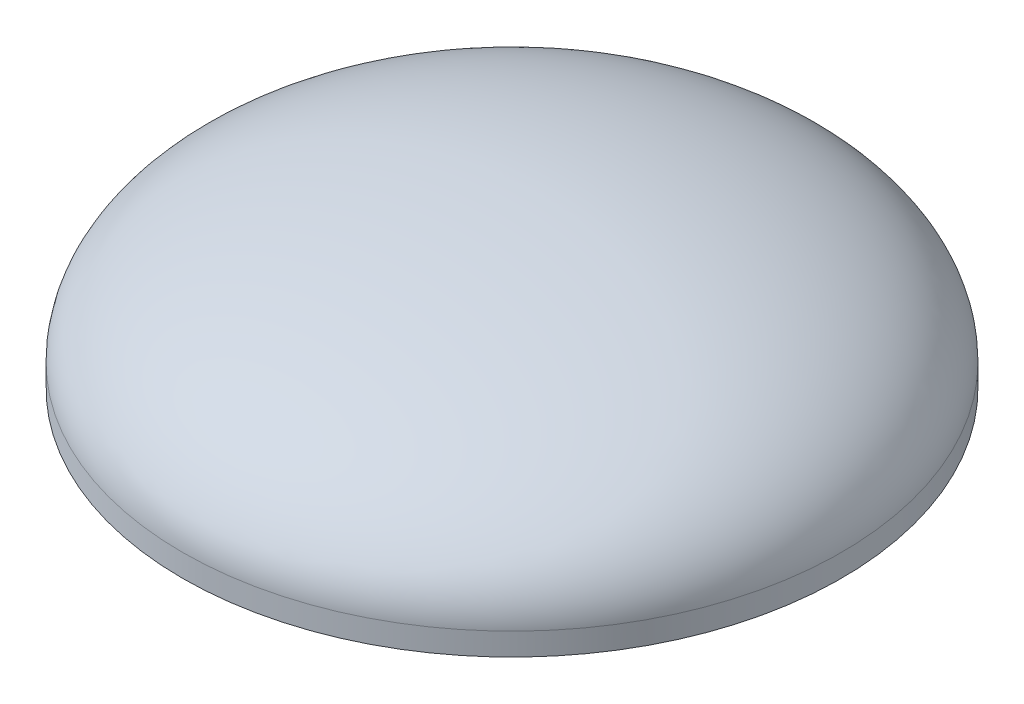
ISO-10303-21;
HEADER;
FILE_DESCRIPTION(('STEP AP214'),'2;1');
FILE_NAME('part.step','',(''),(''),'','','');
FILE_SCHEMA(('AUTOMOTIVE_DESIGN { 1 0 10303 214 1 1 1 1 }'));
ENDSEC;
DATA;
#1=APPLICATION_CONTEXT('core data for automotive mechanical design processes');
#2=APPLICATION_PROTOCOL_DEFINITION('international standard','automotive_design',2000,#1);
#3=PRODUCT_CONTEXT('',#1,'mechanical');
#4=PRODUCT('Part','Part','',(#3));
#5=PRODUCT_RELATED_PRODUCT_CATEGORY('part','',(#4));
#6=PRODUCT_DEFINITION_FORMATION('','',#4);
#7=PRODUCT_DEFINITION_CONTEXT('part definition',#1,'design');
#8=PRODUCT_DEFINITION('design','',#6,#7);
#9=PRODUCT_DEFINITION_SHAPE('','',#8);
#10=(LENGTH_UNIT() NAMED_UNIT(*) SI_UNIT(.MILLI.,.METRE.));
#11=(NAMED_UNIT(*) PLANE_ANGLE_UNIT() SI_UNIT($,.RADIAN.));
#12=(NAMED_UNIT(*) SI_UNIT($,.STERADIAN.) SOLID_ANGLE_UNIT());
#13=UNCERTAINTY_MEASURE_WITH_UNIT(LENGTH_MEASURE(1.E-05),#10,'distance_accuracy_value','');
#14=(GEOMETRIC_REPRESENTATION_CONTEXT(3) GLOBAL_UNCERTAINTY_ASSIGNED_CONTEXT((#13)) GLOBAL_UNIT_ASSIGNED_CONTEXT((#10,
#11,#12)) REPRESENTATION_CONTEXT('',''));
#15=CARTESIAN_POINT('',(0.,0.,0.));
#16=DIRECTION('',(0.,0.,1.));
#17=DIRECTION('',(1.,0.,0.));
#18=AXIS2_PLACEMENT_3D('',#15,#16,#17);
#19=CARTESIAN_POINT('',(-0.01882130497761,32.0962976066643,3.3128423771159));
#20=DIRECTION('',(0.,1.,0.));
#21=DIRECTION('',(0.,0.,1.));
#22=AXIS2_PLACEMENT_3D('',#19,#20,#21);
#23=PLANE('',#22);
#24=CARTESIAN_POINT('',(-0.01882130497761,32.0962976066643,3.3128423771159));
#25=DIRECTION('',(0.,1.,0.));
#26=DIRECTION('',(0.,0.,1.));
#27=AXIS2_PLACEMENT_3D('',#24,#25,#26);
#28=CIRCLE('',#27,22.);
#29=CARTESIAN_POINT('',(-0.01882130497761,32.0962976066643,25.3128423771159));
#30=VERTEX_POINT('',#29);
#31=EDGE_CURVE('E37',#30,#30,#28,.T.);
#32=ORIENTED_EDGE('',*,*,#31,.F.);
#33=EDGE_LOOP('',(#32));
#34=FACE_BOUND('',#33,.T.);
#35=CARTESIAN_POINT('',(-0.01882130497761,32.0962976066643,3.3128423771159));
#36=DIRECTION('',(0.,1.,0.));
#37=DIRECTION('',(0.,0.,1.));
#38=AXIS2_PLACEMENT_3D('',#35,#36,#37);
#39=CIRCLE('',#38,20.);
#40=CARTESIAN_POINT('',(-0.01882130497761,32.0962976066643,23.3128423771159));
#41=VERTEX_POINT('',#40);
#42=EDGE_CURVE('E78',#41,#41,#39,.T.);
#43=ORIENTED_EDGE('',*,*,#42,.T.);
#44=EDGE_LOOP('',(#43));
#45=FACE_BOUND('',#44,.T.);
#46=ADVANCED_FACE('F33',(#34,#45),#23,.F.);
#47=CARTESIAN_POINT('',(-0.01882130497761,33.5962976066643,3.3128423771159));
#48=DIRECTION('',(0.,-1.,0.));
#49=DIRECTION('',(0.,0.,-1.));
#50=AXIS2_PLACEMENT_3D('',#47,#48,#49);
#51=CYLINDRICAL_SURFACE('',#50,22.);
#52=CARTESIAN_POINT('',(-0.01882130497761,33.5962976066643,3.3128423771159));
#53=DIRECTION('',(0.,1.,0.));
#54=DIRECTION('',(0.,0.,1.));
#55=AXIS2_PLACEMENT_3D('',#52,#53,#54);
#56=CIRCLE('',#55,22.);
#57=CARTESIAN_POINT('',(-0.01882130497761,33.5962976066643,25.3128423771159));
#58=VERTEX_POINT('',#57);
#59=EDGE_CURVE('E11',#58,#58,#56,.T.);
#60=ORIENTED_EDGE('',*,*,#59,.F.);
#61=EDGE_LOOP('',(#60));
#62=FACE_BOUND('',#61,.T.);
#63=ORIENTED_EDGE('',*,*,#31,.T.);
#64=EDGE_LOOP('',(#63));
#65=FACE_BOUND('',#64,.T.);
#66=ADVANCED_FACE('F35',(#62,#65),#51,.T.);
#67=CARTESIAN_POINT('',(-0.01882130497761,33.5962976066643,3.3128423771159));
#68=DIRECTION('',(0.,-1.,0.));
#69=DIRECTION('',(0.,0.,-1.));
#70=AXIS2_PLACEMENT_3D('',#67,#68,#69);
#71=CYLINDRICAL_SURFACE('',#70,20.);
#72=CARTESIAN_POINT('',(-0.0188213049776094,33.5962976066643,3.3128423771159));
#73=DIRECTION('',(0.,1.,0.));
#74=DIRECTION('',(-1.,0.,0.));
#75=AXIS2_PLACEMENT_3D('',#72,#73,#74);
#76=CIRCLE('',#75,20.);
#77=CARTESIAN_POINT('',(-20.0188213049776,33.5962976066643,3.3128423771159));
#78=VERTEX_POINT('',#77);
#79=EDGE_CURVE('E75',#78,#78,#76,.T.);
#80=ORIENTED_EDGE('',*,*,#79,.T.);
#81=EDGE_LOOP('',(#80));
#82=FACE_BOUND('',#81,.T.);
#83=ORIENTED_EDGE('',*,*,#42,.F.);
#84=EDGE_LOOP('',(#83));
#85=FACE_BOUND('',#84,.T.);
#86=ADVANCED_FACE('F55',(#82,#85),#71,.F.);
#87=CARTESIAN_POINT('',(-0.0188213049776093,33.5962976066639,3.3128423771159));
#88=DIRECTION('',(0.130526192220045,0.,0.991444861373811));
#89=DIRECTION('',(-0.991444861373811,0.,0.130526192220045));
#90=AXIS2_PLACEMENT_3D('',#87,#88,#89);
#91=ELLIPSE('',#90,20.,8.0000000000004);
#92=TRIMMED_CURVE('',#91,(PARAMETER_VALUE(4.7123889803847)),(PARAMETER_VALUE(7.85398163397449)),
.T.,.PARAMETER.);
#93=CARTESIAN_POINT('',(-0.0188213049776079,46.3611763266446,3.3128423771159));
#94=DIRECTION('',(0.,1.,0.));
#95=AXIS1_PLACEMENT('',#93,#94);
#96=SURFACE_OF_REVOLUTION('',#92,#95);
#97=ORIENTED_EDGE('',*,*,#79,.F.);
#98=EDGE_LOOP('',(#97));
#99=FACE_BOUND('',#98,.T.);
#100=CARTESIAN_POINT('',(-0.0188213049775744,41.5962976066643,3.3128423771159));
#101=VERTEX_POINT('',#100);
#102=VERTEX_LOOP('',#101);
#103=FACE_BOUND('',#102,.T.);
#104=ADVANCED_FACE('F49',(#99,#103),#96,.T.);
#105=CARTESIAN_POINT('',(-0.0188213049776093,33.5962976066639,3.3128423771159));
#106=DIRECTION('',(0.130526192220045,0.,0.991444861373811));
#107=DIRECTION('',(-0.991444861373811,0.,0.130526192220045));
#108=AXIS2_PLACEMENT_3D('',#105,#106,#107);
#109=ELLIPSE('',#108,22.,9.5000000000004);
#110=TRIMMED_CURVE('',#109,(PARAMETER_VALUE(4.7123889803847)),
(PARAMETER_VALUE(7.85398163397449)),.T.,.PARAMETER.);
#111=CARTESIAN_POINT('',(-0.0188213049776079,46.3611763266446,3.3128423771159));
#112=DIRECTION('',(0.,1.,0.));
#113=AXIS1_PLACEMENT('',#111,#112);
#114=SURFACE_OF_REVOLUTION('',#110,#113);
#115=ORIENTED_EDGE('',*,*,#59,.T.);
#116=EDGE_LOOP('',(#115));
#117=FACE_BOUND('',#116,.T.);
#118=CARTESIAN_POINT('',(-0.0188213049775745,43.0962976066643,3.3128423771159));
#119=VERTEX_POINT('',#118);
#120=VERTEX_LOOP('',#119);
#121=FACE_BOUND('',#120,.T.);
#122=ADVANCED_FACE('F47',(#117,#121),#114,.F.);
#123=CLOSED_SHELL('',(#46,#66,#86,#104,#122));
#124=MANIFOLD_SOLID_BREP('B2',#123);
#125=ADVANCED_BREP_SHAPE_REPRESENTATION('',(#18,#124),#14);
#126=SHAPE_DEFINITION_REPRESENTATION(#9,#125);
ENDSEC;
END-ISO-10303-21;
